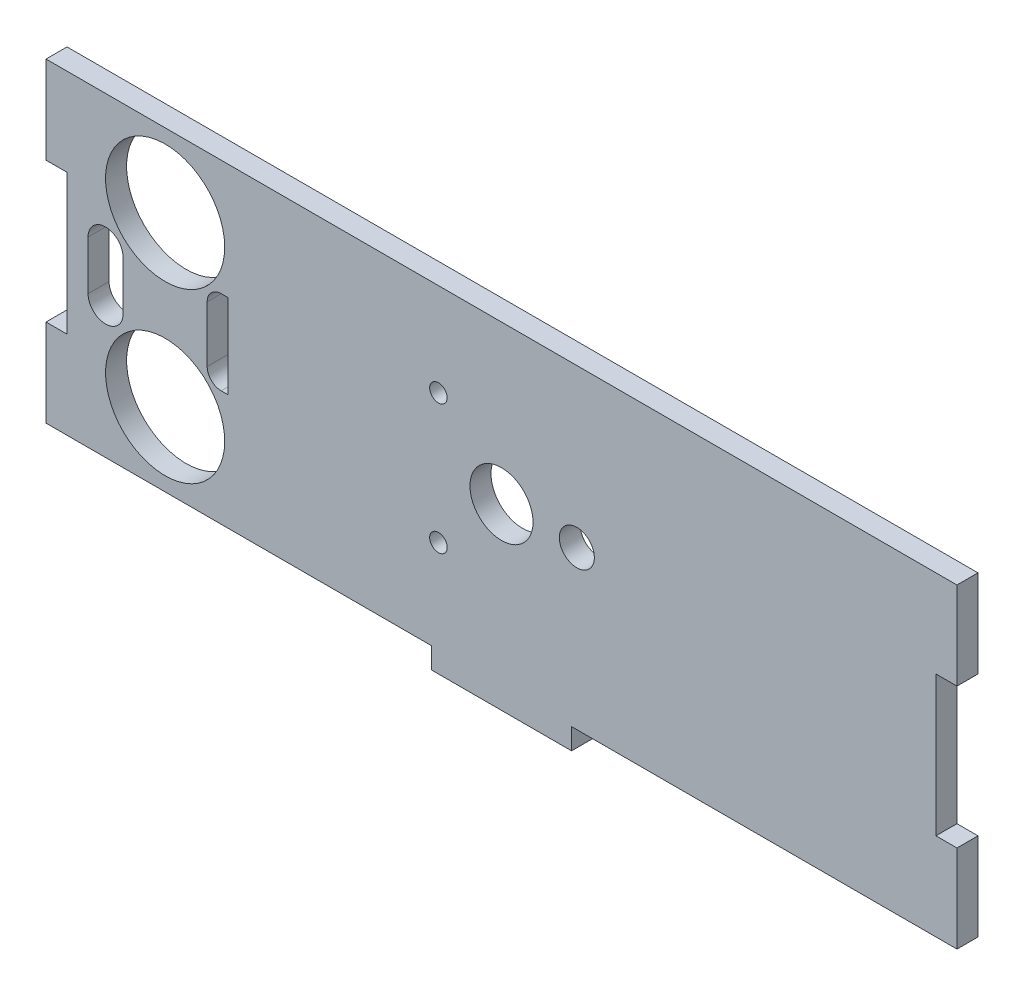
ISO-10303-21;
HEADER;
FILE_DESCRIPTION(('STEP AP214'),'2;1');
FILE_NAME('part.step','',(''),(''),'','','');
FILE_SCHEMA(('AUTOMOTIVE_DESIGN { 1 0 10303 214 1 1 1 1 }'));
ENDSEC;
DATA;
#1=APPLICATION_CONTEXT('core data for automotive mechanical design processes');
#2=APPLICATION_PROTOCOL_DEFINITION('international standard','automotive_design',2000,#1);
#3=PRODUCT_CONTEXT('',#1,'mechanical');
#4=PRODUCT('Part','Part','',(#3));
#5=PRODUCT_RELATED_PRODUCT_CATEGORY('part','',(#4));
#6=PRODUCT_DEFINITION_FORMATION('','',#4);
#7=PRODUCT_DEFINITION_CONTEXT('part definition',#1,'design');
#8=PRODUCT_DEFINITION('design','',#6,#7);
#9=PRODUCT_DEFINITION_SHAPE('','',#8);
#10=(LENGTH_UNIT() NAMED_UNIT(*) SI_UNIT(.MILLI.,.METRE.));
#11=(NAMED_UNIT(*) PLANE_ANGLE_UNIT() SI_UNIT($,.RADIAN.));
#12=(NAMED_UNIT(*) SI_UNIT($,.STERADIAN.) SOLID_ANGLE_UNIT());
#13=UNCERTAINTY_MEASURE_WITH_UNIT(LENGTH_MEASURE(1.E-05),#10,'distance_accuracy_value','');
#14=(GEOMETRIC_REPRESENTATION_CONTEXT(3) GLOBAL_UNCERTAINTY_ASSIGNED_CONTEXT((#13)) GLOBAL_UNIT_ASSIGNED_CONTEXT((#10,
#11,#12)) REPRESENTATION_CONTEXT('',''));
#15=CARTESIAN_POINT('',(0.,0.,0.));
#16=DIRECTION('',(0.,0.,1.));
#17=DIRECTION('',(1.,0.,0.));
#18=AXIS2_PLACEMENT_3D('',#15,#16,#17);
#19=CARTESIAN_POINT('',(0.,0.,3.));
#20=DIRECTION('',(0.,0.,1.));
#21=DIRECTION('',(1.,0.,0.));
#22=AXIS2_PLACEMENT_3D('',#19,#20,#21);
#23=PLANE('',#22);
#24=CARTESIAN_POINT('',(10.75,0.,3.));
#25=DIRECTION('',(0.,0.,1.));
#26=DIRECTION('',(1.,0.,0.));
#27=AXIS2_PLACEMENT_3D('',#24,#25,#26);
#28=CIRCLE('',#27,2.5);
#29=CARTESIAN_POINT('',(13.25,0.,3.));
#30=VERTEX_POINT('',#29);
#31=EDGE_CURVE('E901',#30,#30,#28,.T.);
#32=ORIENTED_EDGE('',*,*,#31,.F.);
#33=EDGE_LOOP('',(#32));
#34=FACE_BOUND('',#33,.T.);
#35=CARTESIAN_POINT('',(-9.,9.25,3.));
#36=DIRECTION('',(0.,0.,1.));
#37=DIRECTION('',(1.,0.,0.));
#38=AXIS2_PLACEMENT_3D('',#35,#36,#37);
#39=CIRCLE('',#38,1.25);
#40=CARTESIAN_POINT('',(-7.75,9.25,3.));
#41=VERTEX_POINT('',#40);
#42=EDGE_CURVE('E261',#41,#41,#39,.T.);
#43=ORIENTED_EDGE('',*,*,#42,.F.);
#44=EDGE_LOOP('',(#43));
#45=FACE_BOUND('',#44,.T.);
#46=CARTESIAN_POINT('',(-48.,12.,3.));
#47=DIRECTION('',(0.,0.,1.));
#48=DIRECTION('',(1.,0.,0.));
#49=AXIS2_PLACEMENT_3D('',#46,#47,#48);
#50=CIRCLE('',#49,8.50000000000001);
#51=CARTESIAN_POINT('',(-39.5,12.,3.));
#52=VERTEX_POINT('',#51);
#53=EDGE_CURVE('E342',#52,#52,#50,.T.);
#54=ORIENTED_EDGE('',*,*,#53,.F.);
#55=EDGE_LOOP('',(#54));
#56=FACE_BOUND('',#55,.T.);
#57=DIRECTION('',(0.,-1.,0.));
#58=VECTOR('',#57,1.);
#59=CARTESIAN_POINT('',(-65.,10.,3.));
#60=LINE('',#59,#58);
#61=CARTESIAN_POINT('',(-65.,22.5,3.));
#62=VERTEX_POINT('',#61);
#63=CARTESIAN_POINT('',(-65.,10.,3.));
#64=VERTEX_POINT('',#63);
#65=EDGE_CURVE('E350',#62,#64,#60,.T.);
#66=ORIENTED_EDGE('',*,*,#65,.T.);
#67=DIRECTION('',(1.,0.,0.));
#68=VECTOR('',#67,1.);
#69=CARTESIAN_POINT('',(-62.,10.,3.));
#70=LINE('',#69,#68);
#71=CARTESIAN_POINT('',(-62.,10.,3.));
#72=VERTEX_POINT('',#71);
#73=EDGE_CURVE('E354',#64,#72,#70,.T.);
#74=ORIENTED_EDGE('',*,*,#73,.T.);
#75=DIRECTION('',(0.,-1.,0.));
#76=VECTOR('',#75,1.);
#77=CARTESIAN_POINT('',(-62.,-10.,3.));
#78=LINE('',#77,#76);
#79=CARTESIAN_POINT('',(-62.,-10.,3.));
#80=VERTEX_POINT('',#79);
#81=EDGE_CURVE('E358',#72,#80,#78,.T.);
#82=ORIENTED_EDGE('',*,*,#81,.T.);
#83=DIRECTION('',(-1.,0.,0.));
#84=VECTOR('',#83,1.);
#85=CARTESIAN_POINT('',(-62.,-10.,3.));
#86=LINE('',#85,#84);
#87=CARTESIAN_POINT('',(-65.,-10.,3.));
#88=VERTEX_POINT('',#87);
#89=EDGE_CURVE('E361',#80,#88,#86,.T.);
#90=ORIENTED_EDGE('',*,*,#89,.T.);
#91=DIRECTION('',(0.,-1.,0.));
#92=VECTOR('',#91,1.);
#93=CARTESIAN_POINT('',(-65.,-22.5,3.));
#94=LINE('',#93,#92);
#95=CARTESIAN_POINT('',(-65.,-22.5,3.));
#96=VERTEX_POINT('',#95);
#97=EDGE_CURVE('E364',#88,#96,#94,.T.);
#98=ORIENTED_EDGE('',*,*,#97,.T.);
#99=DIRECTION('',(1.,0.,0.));
#100=VECTOR('',#99,1.);
#101=CARTESIAN_POINT('',(-10.,-22.5,3.));
#102=LINE('',#101,#100);
#103=CARTESIAN_POINT('',(-10.,-22.5,3.));
#104=VERTEX_POINT('',#103);
#105=EDGE_CURVE('E367',#96,#104,#102,.T.);
#106=ORIENTED_EDGE('',*,*,#105,.T.);
#107=DIRECTION('',(0.,-1.,0.));
#108=VECTOR('',#107,1.);
#109=CARTESIAN_POINT('',(-10.,-22.5,3.));
#110=LINE('',#109,#108);
#111=CARTESIAN_POINT('',(-10.,-25.5,3.));
#112=VERTEX_POINT('',#111);
#113=EDGE_CURVE('E370',#104,#112,#110,.T.);
#114=ORIENTED_EDGE('',*,*,#113,.T.);
#115=DIRECTION('',(1.,0.,0.));
#116=VECTOR('',#115,1.);
#117=CARTESIAN_POINT('',(-10.,-25.5,3.));
#118=LINE('',#117,#116);
#119=CARTESIAN_POINT('',(10.,-25.5,3.));
#120=VERTEX_POINT('',#119);
#121=EDGE_CURVE('E373',#112,#120,#118,.T.);
#122=ORIENTED_EDGE('',*,*,#121,.T.);
#123=DIRECTION('',(0.,1.,0.));
#124=VECTOR('',#123,1.);
#125=CARTESIAN_POINT('',(10.,-22.5,3.));
#126=LINE('',#125,#124);
#127=CARTESIAN_POINT('',(10.,-22.5,3.));
#128=VERTEX_POINT('',#127);
#129=EDGE_CURVE('E376',#120,#128,#126,.T.);
#130=ORIENTED_EDGE('',*,*,#129,.T.);
#131=DIRECTION('',(1.,0.,0.));
#132=VECTOR('',#131,1.);
#133=CARTESIAN_POINT('',(65.,-22.5,3.));
#134=LINE('',#133,#132);
#135=CARTESIAN_POINT('',(65.,-22.5,3.));
#136=VERTEX_POINT('',#135);
#137=EDGE_CURVE('E379',#128,#136,#134,.T.);
#138=ORIENTED_EDGE('',*,*,#137,.T.);
#139=DIRECTION('',(0.,1.,0.));
#140=VECTOR('',#139,1.);
#141=CARTESIAN_POINT('',(65.,-22.5,3.));
#142=LINE('',#141,#140);
#143=CARTESIAN_POINT('',(65.,-10.,3.));
#144=VERTEX_POINT('',#143);
#145=EDGE_CURVE('E382',#136,#144,#142,.T.);
#146=ORIENTED_EDGE('',*,*,#145,.T.);
#147=DIRECTION('',(-1.,0.,0.));
#148=VECTOR('',#147,1.);
#149=CARTESIAN_POINT('',(62.,-10.,3.));
#150=LINE('',#149,#148);
#151=CARTESIAN_POINT('',(62.,-10.,3.));
#152=VERTEX_POINT('',#151);
#153=EDGE_CURVE('E385',#144,#152,#150,.T.);
#154=ORIENTED_EDGE('',*,*,#153,.T.);
#155=DIRECTION('',(0.,1.,0.));
#156=VECTOR('',#155,1.);
#157=CARTESIAN_POINT('',(62.,-10.,3.));
#158=LINE('',#157,#156);
#159=CARTESIAN_POINT('',(62.,10.,3.));
#160=VERTEX_POINT('',#159);
#161=EDGE_CURVE('E388',#152,#160,#158,.T.);
#162=ORIENTED_EDGE('',*,*,#161,.T.);
#163=DIRECTION('',(1.,0.,0.));
#164=VECTOR('',#163,1.);
#165=CARTESIAN_POINT('',(62.,10.,3.));
#166=LINE('',#165,#164);
#167=CARTESIAN_POINT('',(65.,10.,3.));
#168=VERTEX_POINT('',#167);
#169=EDGE_CURVE('E391',#160,#168,#166,.T.);
#170=ORIENTED_EDGE('',*,*,#169,.T.);
#171=DIRECTION('',(0.,1.,0.));
#172=VECTOR('',#171,1.);
#173=CARTESIAN_POINT('',(65.,10.,3.));
#174=LINE('',#173,#172);
#175=CARTESIAN_POINT('',(65.,22.5,3.));
#176=VERTEX_POINT('',#175);
#177=EDGE_CURVE('E394',#168,#176,#174,.T.);
#178=ORIENTED_EDGE('',*,*,#177,.T.);
#179=DIRECTION('',(-1.,0.,0.));
#180=VECTOR('',#179,1.);
#181=CARTESIAN_POINT('',(65.,22.5,3.));
#182=LINE('',#181,#180);
#183=EDGE_CURVE('E397',#176,#62,#182,.T.);
#184=ORIENTED_EDGE('',*,*,#183,.T.);
#185=EDGE_LOOP('',(#66,#74,#82,#90,#98,#106,#114,#122,#130,#138,#146,#154,#162,#170,#178,#184));
#186=FACE_BOUND('',#185,.T.);
#187=CARTESIAN_POINT('',(-48.,-12.,3.));
#188=DIRECTION('',(0.,0.,1.));
#189=DIRECTION('',(1.,0.,0.));
#190=AXIS2_PLACEMENT_3D('',#187,#188,#189);
#191=CIRCLE('',#190,8.50000000000001);
#192=CARTESIAN_POINT('',(-39.5,-12.,3.));
#193=VERTEX_POINT('',#192);
#194=EDGE_CURVE('E334',#193,#193,#191,.T.);
#195=ORIENTED_EDGE('',*,*,#194,.F.);
#196=EDGE_LOOP('',(#195));
#197=FACE_BOUND('',#196,.T.);
#198=DIRECTION('',(0.,-1.,0.));
#199=VECTOR('',#198,1.);
#200=CARTESIAN_POINT('',(-59.,3.5,3.));
#201=LINE('',#200,#199);
#202=CARTESIAN_POINT('',(-59.,3.5,3.));
#203=VERTEX_POINT('',#202);
#204=CARTESIAN_POINT('',(-59.,-3.5,3.));
#205=VERTEX_POINT('',#204);
#206=EDGE_CURVE('E294',#203,#205,#201,.T.);
#207=ORIENTED_EDGE('',*,*,#206,.F.);
#208=CARTESIAN_POINT('',(-56.5,3.5,3.));
#209=DIRECTION('',(0.,0.,1.));
#210=DIRECTION('',(1.,0.,0.));
#211=AXIS2_PLACEMENT_3D('',#208,#209,#210);
#212=CIRCLE('',#211,2.5);
#213=CARTESIAN_POINT('',(-54.,3.5,3.));
#214=VERTEX_POINT('',#213);
#215=EDGE_CURVE('E291',#214,#203,#212,.T.);
#216=ORIENTED_EDGE('',*,*,#215,.F.);
#217=DIRECTION('',(0.,1.,0.));
#218=VECTOR('',#217,1.);
#219=CARTESIAN_POINT('',(-54.,3.5,3.));
#220=LINE('',#219,#218);
#221=CARTESIAN_POINT('',(-54.,-3.5,3.));
#222=VERTEX_POINT('',#221);
#223=EDGE_CURVE('E302',#222,#214,#220,.T.);
#224=ORIENTED_EDGE('',*,*,#223,.F.);
#225=CARTESIAN_POINT('',(-56.5,-3.5,3.));
#226=DIRECTION('',(0.,0.,1.));
#227=DIRECTION('',(1.,0.,0.));
#228=AXIS2_PLACEMENT_3D('',#225,#226,#227);
#229=CIRCLE('',#228,2.5);
#230=EDGE_CURVE('E298',#205,#222,#229,.T.);
#231=ORIENTED_EDGE('',*,*,#230,.F.);
#232=EDGE_LOOP('',(#207,#216,#224,#231));
#233=FACE_BOUND('',#232,.T.);
#234=DIRECTION('',(1.,0.,0.));
#235=VECTOR('',#234,1.);
#236=CARTESIAN_POINT('',(-39.,-6.,3.));
#237=LINE('',#236,#235);
#238=CARTESIAN_POINT('',(-40.,-6.,3.));
#239=VERTEX_POINT('',#238);
#240=CARTESIAN_POINT('',(-39.,-6.,3.));
#241=VERTEX_POINT('',#240);
#242=EDGE_CURVE('E228',#239,#241,#237,.T.);
#243=ORIENTED_EDGE('',*,*,#242,.F.);
#244=CARTESIAN_POINT('',(-40.,-4.,3.));
#245=DIRECTION('',(0.,0.,1.));
#246=DIRECTION('',(-1.,0.,0.));
#247=AXIS2_PLACEMENT_3D('',#244,#245,#246);
#248=CIRCLE('',#247,2.);
#249=CARTESIAN_POINT('',(-42.,-4.,3.));
#250=VERTEX_POINT('',#249);
#251=EDGE_CURVE('E219',#250,#239,#248,.T.);
#252=ORIENTED_EDGE('',*,*,#251,.F.);
#253=DIRECTION('',(0.,-1.,0.));
#254=VECTOR('',#253,1.);
#255=CARTESIAN_POINT('',(-42.,-4.,3.));
#256=LINE('',#255,#254);
#257=CARTESIAN_POINT('',(-42.,4.,3.));
#258=VERTEX_POINT('',#257);
#259=EDGE_CURVE('E256',#258,#250,#256,.T.);
#260=ORIENTED_EDGE('',*,*,#259,.F.);
#261=CARTESIAN_POINT('',(-40.,4.,3.));
#262=DIRECTION('',(0.,0.,1.));
#263=DIRECTION('',(1.,0.,0.));
#264=AXIS2_PLACEMENT_3D('',#261,#262,#263);
#265=CIRCLE('',#264,2.);
#266=CARTESIAN_POINT('',(-40.,6.,3.));
#267=VERTEX_POINT('',#266);
#268=EDGE_CURVE('E253',#267,#258,#265,.T.);
#269=ORIENTED_EDGE('',*,*,#268,.F.);
#270=DIRECTION('',(-1.,0.,0.));
#271=VECTOR('',#270,1.);
#272=CARTESIAN_POINT('',(-39.,6.,3.));
#273=LINE('',#272,#271);
#274=CARTESIAN_POINT('',(-39.,6.,3.));
#275=VERTEX_POINT('',#274);
#276=EDGE_CURVE('E247',#275,#267,#273,.T.);
#277=ORIENTED_EDGE('',*,*,#276,.F.);
#278=DIRECTION('',(0.,1.,0.));
#279=VECTOR('',#278,1.);
#280=CARTESIAN_POINT('',(-39.,-6.,3.));
#281=LINE('',#280,#279);
#282=EDGE_CURVE('E243',#241,#275,#281,.T.);
#283=ORIENTED_EDGE('',*,*,#282,.F.);
#284=EDGE_LOOP('',(#243,#252,#260,#269,#277,#283));
#285=FACE_BOUND('',#284,.T.);
#286=CARTESIAN_POINT('',(0.,0.,3.));
#287=DIRECTION('',(0.,0.,1.));
#288=DIRECTION('',(1.,0.,0.));
#289=AXIS2_PLACEMENT_3D('',#286,#287,#288);
#290=CIRCLE('',#289,4.5);
#291=CARTESIAN_POINT('',(4.5,0.,3.));
#292=VERTEX_POINT('',#291);
#293=EDGE_CURVE('E909',#292,#292,#290,.T.);
#294=ORIENTED_EDGE('',*,*,#293,.F.);
#295=EDGE_LOOP('',(#294));
#296=FACE_BOUND('',#295,.T.);
#297=CARTESIAN_POINT('',(-9.,-9.25,3.));
#298=DIRECTION('',(0.,0.,1.));
#299=DIRECTION('',(-1.,0.,0.));
#300=AXIS2_PLACEMENT_3D('',#297,#298,#299);
#301=CIRCLE('',#300,1.25);
#302=CARTESIAN_POINT('',(-10.25,-9.25,3.));
#303=VERTEX_POINT('',#302);
#304=EDGE_CURVE('E890',#303,#303,#301,.T.);
#305=ORIENTED_EDGE('',*,*,#304,.F.);
#306=EDGE_LOOP('',(#305));
#307=FACE_BOUND('',#306,.T.);
#308=ADVANCED_FACE('F45',(#34,#45,#56,#186,#197,#233,#285,#296,#307),#23,.T.);
#309=CARTESIAN_POINT('',(0.,0.,0.));
#310=DIRECTION('',(0.,0.,1.));
#311=DIRECTION('',(1.,0.,0.));
#312=AXIS2_PLACEMENT_3D('',#309,#310,#311);
#313=PLANE('',#312);
#314=CARTESIAN_POINT('',(-56.5,3.5,0.));
#315=DIRECTION('',(0.,0.,1.));
#316=DIRECTION('',(1.,0.,0.));
#317=AXIS2_PLACEMENT_3D('',#314,#315,#316);
#318=CIRCLE('',#317,2.5);
#319=CARTESIAN_POINT('',(-54.,3.5,0.));
#320=VERTEX_POINT('',#319);
#321=CARTESIAN_POINT('',(-59.,3.5,0.));
#322=VERTEX_POINT('',#321);
#323=EDGE_CURVE('E237',#320,#322,#318,.T.);
#324=ORIENTED_EDGE('',*,*,#323,.T.);
#325=DIRECTION('',(0.,-1.,0.));
#326=VECTOR('',#325,1.);
#327=CARTESIAN_POINT('',(-59.,3.5,0.));
#328=LINE('',#327,#326);
#329=CARTESIAN_POINT('',(-59.,-3.5,0.));
#330=VERTEX_POINT('',#329);
#331=EDGE_CURVE('E309',#322,#330,#328,.T.);
#332=ORIENTED_EDGE('',*,*,#331,.T.);
#333=CARTESIAN_POINT('',(-56.5,-3.5,0.));
#334=DIRECTION('',(0.,0.,1.));
#335=DIRECTION('',(1.,0.,0.));
#336=AXIS2_PLACEMENT_3D('',#333,#334,#335);
#337=CIRCLE('',#336,2.5);
#338=CARTESIAN_POINT('',(-54.,-3.5,0.));
#339=VERTEX_POINT('',#338);
#340=EDGE_CURVE('E313',#330,#339,#337,.T.);
#341=ORIENTED_EDGE('',*,*,#340,.T.);
#342=DIRECTION('',(0.,1.,0.));
#343=VECTOR('',#342,1.);
#344=CARTESIAN_POINT('',(-54.,3.5,0.));
#345=LINE('',#344,#343);
#346=EDGE_CURVE('E295',#339,#320,#345,.T.);
#347=ORIENTED_EDGE('',*,*,#346,.T.);
#348=EDGE_LOOP('',(#324,#332,#341,#347));
#349=FACE_BOUND('',#348,.T.);
#350=DIRECTION('',(0.,-1.,0.));
#351=VECTOR('',#350,1.);
#352=CARTESIAN_POINT('',(-65.,10.,0.));
#353=LINE('',#352,#351);
#354=CARTESIAN_POINT('',(-65.,22.5,0.));
#355=VERTEX_POINT('',#354);
#356=CARTESIAN_POINT('',(-65.,10.,0.));
#357=VERTEX_POINT('',#356);
#358=EDGE_CURVE('E346',#355,#357,#353,.T.);
#359=ORIENTED_EDGE('',*,*,#358,.F.);
#360=DIRECTION('',(-1.,0.,0.));
#361=VECTOR('',#360,1.);
#362=CARTESIAN_POINT('',(65.,22.5,0.));
#363=LINE('',#362,#361);
#364=CARTESIAN_POINT('',(65.,22.5,0.));
#365=VERTEX_POINT('',#364);
#366=EDGE_CURVE('E355',#365,#355,#363,.T.);
#367=ORIENTED_EDGE('',*,*,#366,.F.);
#368=DIRECTION('',(0.,1.,0.));
#369=VECTOR('',#368,1.);
#370=CARTESIAN_POINT('',(65.,10.,0.));
#371=LINE('',#370,#369);
#372=CARTESIAN_POINT('',(65.,10.,0.));
#373=VERTEX_POINT('',#372);
#374=EDGE_CURVE('E443',#373,#365,#371,.T.);
#375=ORIENTED_EDGE('',*,*,#374,.F.);
#376=DIRECTION('',(1.,0.,0.));
#377=VECTOR('',#376,1.);
#378=CARTESIAN_POINT('',(62.,10.,0.));
#379=LINE('',#378,#377);
#380=CARTESIAN_POINT('',(62.,10.,0.));
#381=VERTEX_POINT('',#380);
#382=EDGE_CURVE('E440',#381,#373,#379,.T.);
#383=ORIENTED_EDGE('',*,*,#382,.F.);
#384=DIRECTION('',(0.,1.,0.));
#385=VECTOR('',#384,1.);
#386=CARTESIAN_POINT('',(62.,-10.,0.));
#387=LINE('',#386,#385);
#388=CARTESIAN_POINT('',(62.,-10.,0.));
#389=VERTEX_POINT('',#388);
#390=EDGE_CURVE('E437',#389,#381,#387,.T.);
#391=ORIENTED_EDGE('',*,*,#390,.F.);
#392=DIRECTION('',(-1.,0.,0.));
#393=VECTOR('',#392,1.);
#394=CARTESIAN_POINT('',(62.,-10.,0.));
#395=LINE('',#394,#393);
#396=CARTESIAN_POINT('',(65.,-10.,0.));
#397=VERTEX_POINT('',#396);
#398=EDGE_CURVE('E434',#397,#389,#395,.T.);
#399=ORIENTED_EDGE('',*,*,#398,.F.);
#400=DIRECTION('',(0.,1.,0.));
#401=VECTOR('',#400,1.);
#402=CARTESIAN_POINT('',(65.,-22.5,0.));
#403=LINE('',#402,#401);
#404=CARTESIAN_POINT('',(65.,-22.5,0.));
#405=VERTEX_POINT('',#404);
#406=EDGE_CURVE('E431',#405,#397,#403,.T.);
#407=ORIENTED_EDGE('',*,*,#406,.F.);
#408=DIRECTION('',(1.,0.,0.));
#409=VECTOR('',#408,1.);
#410=CARTESIAN_POINT('',(65.,-22.5,0.));
#411=LINE('',#410,#409);
#412=CARTESIAN_POINT('',(10.,-22.5,0.));
#413=VERTEX_POINT('',#412);
#414=EDGE_CURVE('E428',#413,#405,#411,.T.);
#415=ORIENTED_EDGE('',*,*,#414,.F.);
#416=DIRECTION('',(0.,1.,0.));
#417=VECTOR('',#416,1.);
#418=CARTESIAN_POINT('',(10.,-22.5,0.));
#419=LINE('',#418,#417);
#420=CARTESIAN_POINT('',(10.,-25.5,0.));
#421=VERTEX_POINT('',#420);
#422=EDGE_CURVE('E425',#421,#413,#419,.T.);
#423=ORIENTED_EDGE('',*,*,#422,.F.);
#424=DIRECTION('',(1.,0.,0.));
#425=VECTOR('',#424,1.);
#426=CARTESIAN_POINT('',(-10.,-25.5,0.));
#427=LINE('',#426,#425);
#428=CARTESIAN_POINT('',(-10.,-25.5,0.));
#429=VERTEX_POINT('',#428);
#430=EDGE_CURVE('E422',#429,#421,#427,.T.);
#431=ORIENTED_EDGE('',*,*,#430,.F.);
#432=DIRECTION('',(0.,-1.,0.));
#433=VECTOR('',#432,1.);
#434=CARTESIAN_POINT('',(-10.,-22.5,0.));
#435=LINE('',#434,#433);
#436=CARTESIAN_POINT('',(-10.,-22.5,0.));
#437=VERTEX_POINT('',#436);
#438=EDGE_CURVE('E419',#437,#429,#435,.T.);
#439=ORIENTED_EDGE('',*,*,#438,.F.);
#440=DIRECTION('',(1.,0.,0.));
#441=VECTOR('',#440,1.);
#442=CARTESIAN_POINT('',(-10.,-22.5,0.));
#443=LINE('',#442,#441);
#444=CARTESIAN_POINT('',(-65.,-22.5,0.));
#445=VERTEX_POINT('',#444);
#446=EDGE_CURVE('E416',#445,#437,#443,.T.);
#447=ORIENTED_EDGE('',*,*,#446,.F.);
#448=DIRECTION('',(0.,-1.,0.));
#449=VECTOR('',#448,1.);
#450=CARTESIAN_POINT('',(-65.,-22.5,0.));
#451=LINE('',#450,#449);
#452=CARTESIAN_POINT('',(-65.,-10.,0.));
#453=VERTEX_POINT('',#452);
#454=EDGE_CURVE('E413',#453,#445,#451,.T.);
#455=ORIENTED_EDGE('',*,*,#454,.F.);
#456=DIRECTION('',(-1.,0.,0.));
#457=VECTOR('',#456,1.);
#458=CARTESIAN_POINT('',(-62.,-10.,0.));
#459=LINE('',#458,#457);
#460=CARTESIAN_POINT('',(-62.,-10.,0.));
#461=VERTEX_POINT('',#460);
#462=EDGE_CURVE('E410',#461,#453,#459,.T.);
#463=ORIENTED_EDGE('',*,*,#462,.F.);
#464=DIRECTION('',(0.,-1.,0.));
#465=VECTOR('',#464,1.);
#466=CARTESIAN_POINT('',(-62.,-10.,0.));
#467=LINE('',#466,#465);
#468=CARTESIAN_POINT('',(-62.,10.,0.));
#469=VERTEX_POINT('',#468);
#470=EDGE_CURVE('E407',#469,#461,#467,.T.);
#471=ORIENTED_EDGE('',*,*,#470,.F.);
#472=DIRECTION('',(1.,0.,0.));
#473=VECTOR('',#472,1.);
#474=CARTESIAN_POINT('',(-62.,10.,0.));
#475=LINE('',#474,#473);
#476=EDGE_CURVE('E404',#357,#469,#475,.T.);
#477=ORIENTED_EDGE('',*,*,#476,.F.);
#478=EDGE_LOOP('',(#359,#367,#375,#383,#391,#399,#407,#415,#423,#431,#439,#447,#455,#463,#471,#477));
#479=FACE_BOUND('',#478,.T.);
#480=CARTESIAN_POINT('',(-48.,12.,0.));
#481=DIRECTION('',(0.,0.,1.));
#482=DIRECTION('',(1.,0.,0.));
#483=AXIS2_PLACEMENT_3D('',#480,#481,#482);
#484=CIRCLE('',#483,8.50000000000001);
#485=CARTESIAN_POINT('',(-39.5,12.,0.));
#486=VERTEX_POINT('',#485);
#487=EDGE_CURVE('E338',#486,#486,#484,.T.);
#488=ORIENTED_EDGE('',*,*,#487,.T.);
#489=EDGE_LOOP('',(#488));
#490=FACE_BOUND('',#489,.T.);
#491=CARTESIAN_POINT('',(-48.,-12.,0.));
#492=DIRECTION('',(0.,0.,1.));
#493=DIRECTION('',(1.,0.,0.));
#494=AXIS2_PLACEMENT_3D('',#491,#492,#493);
#495=CIRCLE('',#494,8.50000000000001);
#496=CARTESIAN_POINT('',(-39.5,-12.,0.));
#497=VERTEX_POINT('',#496);
#498=EDGE_CURVE('E333',#497,#497,#495,.T.);
#499=ORIENTED_EDGE('',*,*,#498,.T.);
#500=EDGE_LOOP('',(#499));
#501=FACE_BOUND('',#500,.T.);
#502=CARTESIAN_POINT('',(-40.,-4.,0.));
#503=DIRECTION('',(0.,0.,1.));
#504=DIRECTION('',(-1.,0.,0.));
#505=AXIS2_PLACEMENT_3D('',#502,#503,#504);
#506=CIRCLE('',#505,2.);
#507=CARTESIAN_POINT('',(-42.,-4.,0.));
#508=VERTEX_POINT('',#507);
#509=CARTESIAN_POINT('',(-40.,-6.,0.));
#510=VERTEX_POINT('',#509);
#511=EDGE_CURVE('E69',#508,#510,#506,.T.);
#512=ORIENTED_EDGE('',*,*,#511,.T.);
#513=DIRECTION('',(1.,0.,0.));
#514=VECTOR('',#513,1.);
#515=CARTESIAN_POINT('',(-39.,-6.,0.));
#516=LINE('',#515,#514);
#517=CARTESIAN_POINT('',(-39.,-6.,0.));
#518=VERTEX_POINT('',#517);
#519=EDGE_CURVE('E235',#510,#518,#516,.T.);
#520=ORIENTED_EDGE('',*,*,#519,.T.);
#521=DIRECTION('',(0.,1.,0.));
#522=VECTOR('',#521,1.);
#523=CARTESIAN_POINT('',(-39.,-6.,0.));
#524=LINE('',#523,#522);
#525=CARTESIAN_POINT('',(-39.,6.,0.));
#526=VERTEX_POINT('',#525);
#527=EDGE_CURVE('E264',#518,#526,#524,.T.);
#528=ORIENTED_EDGE('',*,*,#527,.T.);
#529=DIRECTION('',(-1.,0.,0.));
#530=VECTOR('',#529,1.);
#531=CARTESIAN_POINT('',(-39.,6.,0.));
#532=LINE('',#531,#530);
#533=CARTESIAN_POINT('',(-40.,6.,0.));
#534=VERTEX_POINT('',#533);
#535=EDGE_CURVE('E268',#526,#534,#532,.T.);
#536=ORIENTED_EDGE('',*,*,#535,.T.);
#537=CARTESIAN_POINT('',(-40.,4.,0.));
#538=DIRECTION('',(0.,0.,1.));
#539=DIRECTION('',(1.,0.,0.));
#540=AXIS2_PLACEMENT_3D('',#537,#538,#539);
#541=CIRCLE('',#540,2.);
#542=CARTESIAN_POINT('',(-42.,4.,0.));
#543=VERTEX_POINT('',#542);
#544=EDGE_CURVE('E272',#534,#543,#541,.T.);
#545=ORIENTED_EDGE('',*,*,#544,.T.);
#546=DIRECTION('',(0.,-1.,0.));
#547=VECTOR('',#546,1.);
#548=CARTESIAN_POINT('',(-42.,-4.,0.));
#549=LINE('',#548,#547);
#550=EDGE_CURVE('E229',#543,#508,#549,.T.);
#551=ORIENTED_EDGE('',*,*,#550,.T.);
#552=EDGE_LOOP('',(#512,#520,#528,#536,#545,#551));
#553=FACE_BOUND('',#552,.T.);
#554=CARTESIAN_POINT('',(-9.,9.25,0.));
#555=DIRECTION('',(0.,0.,1.));
#556=DIRECTION('',(1.,0.,0.));
#557=AXIS2_PLACEMENT_3D('',#554,#555,#556);
#558=CIRCLE('',#557,1.25);
#559=CARTESIAN_POINT('',(-7.75,9.25,0.));
#560=VERTEX_POINT('',#559);
#561=EDGE_CURVE('E913',#560,#560,#558,.T.);
#562=ORIENTED_EDGE('',*,*,#561,.T.);
#563=EDGE_LOOP('',(#562));
#564=FACE_BOUND('',#563,.T.);
#565=CARTESIAN_POINT('',(0.,0.,0.));
#566=DIRECTION('',(0.,0.,1.));
#567=DIRECTION('',(1.,0.,0.));
#568=AXIS2_PLACEMENT_3D('',#565,#566,#567);
#569=CIRCLE('',#568,4.5);
#570=CARTESIAN_POINT('',(4.5,0.,0.));
#571=VERTEX_POINT('',#570);
#572=EDGE_CURVE('E905',#571,#571,#569,.T.);
#573=ORIENTED_EDGE('',*,*,#572,.T.);
#574=EDGE_LOOP('',(#573));
#575=FACE_BOUND('',#574,.T.);
#576=CARTESIAN_POINT('',(10.75,0.,0.));
#577=DIRECTION('',(0.,0.,1.));
#578=DIRECTION('',(1.,0.,0.));
#579=AXIS2_PLACEMENT_3D('',#576,#577,#578);
#580=CIRCLE('',#579,2.5);
#581=CARTESIAN_POINT('',(13.25,0.,0.));
#582=VERTEX_POINT('',#581);
#583=EDGE_CURVE('E898',#582,#582,#580,.T.);
#584=ORIENTED_EDGE('',*,*,#583,.T.);
#585=EDGE_LOOP('',(#584));
#586=FACE_BOUND('',#585,.T.);
#587=CARTESIAN_POINT('',(-9.,-9.25,0.));
#588=DIRECTION('',(0.,0.,1.));
#589=DIRECTION('',(-1.,0.,0.));
#590=AXIS2_PLACEMENT_3D('',#587,#588,#589);
#591=CIRCLE('',#590,1.25);
#592=CARTESIAN_POINT('',(-10.25,-9.25,0.));
#593=VERTEX_POINT('',#592);
#594=EDGE_CURVE('E893',#593,#593,#591,.T.);
#595=ORIENTED_EDGE('',*,*,#594,.T.);
#596=EDGE_LOOP('',(#595));
#597=FACE_BOUND('',#596,.T.);
#598=ADVANCED_FACE('F514',(#349,#479,#490,#501,#553,#564,#575,#586,#597),#313,.F.);
#599=CARTESIAN_POINT('',(-65.,10.,3.));
#600=DIRECTION('',(1.,0.,0.));
#601=DIRECTION('',(0.,1.,0.));
#602=AXIS2_PLACEMENT_3D('',#599,#600,#601);
#603=PLANE('',#602);
#604=ORIENTED_EDGE('',*,*,#358,.T.);
#605=DIRECTION('',(0.,0.,-1.));
#606=VECTOR('',#605,1.);
#607=CARTESIAN_POINT('',(-65.,10.,3.));
#608=LINE('',#607,#606);
#609=EDGE_CURVE('E11',#64,#357,#608,.T.);
#610=ORIENTED_EDGE('',*,*,#609,.F.);
#611=ORIENTED_EDGE('',*,*,#65,.F.);
#612=DIRECTION('',(0.,0.,-1.));
#613=VECTOR('',#612,1.);
#614=CARTESIAN_POINT('',(-65.,22.5,3.));
#615=LINE('',#614,#613);
#616=EDGE_CURVE('E400',#62,#355,#615,.T.);
#617=ORIENTED_EDGE('',*,*,#616,.T.);
#618=EDGE_LOOP('',(#604,#610,#611,#617));
#619=FACE_BOUND('',#618,.T.);
#620=ADVANCED_FACE('F47',(#619),#603,.F.);
#621=CARTESIAN_POINT('',(-62.,10.,3.));
#622=DIRECTION('',(0.,1.,0.));
#623=DIRECTION('',(-1.,0.,0.));
#624=AXIS2_PLACEMENT_3D('',#621,#622,#623);
#625=PLANE('',#624);
#626=ORIENTED_EDGE('',*,*,#476,.T.);
#627=DIRECTION('',(0.,0.,-1.));
#628=VECTOR('',#627,1.);
#629=CARTESIAN_POINT('',(-62.,10.,3.));
#630=LINE('',#629,#628);
#631=EDGE_CURVE('E54',#72,#469,#630,.T.);
#632=ORIENTED_EDGE('',*,*,#631,.F.);
#633=ORIENTED_EDGE('',*,*,#73,.F.);
#634=ORIENTED_EDGE('',*,*,#609,.T.);
#635=EDGE_LOOP('',(#626,#632,#633,#634));
#636=FACE_BOUND('',#635,.T.);
#637=ADVANCED_FACE('F532',(#636),#625,.F.);
#638=CARTESIAN_POINT('',(-62.,-10.,3.));
#639=DIRECTION('',(1.,0.,0.));
#640=DIRECTION('',(0.,0.,-1.));
#641=AXIS2_PLACEMENT_3D('',#638,#639,#640);
#642=PLANE('',#641);
#643=ORIENTED_EDGE('',*,*,#470,.T.);
#644=DIRECTION('',(0.,0.,-1.));
#645=VECTOR('',#644,1.);
#646=CARTESIAN_POINT('',(-62.,-10.,3.));
#647=LINE('',#646,#645);
#648=EDGE_CURVE('E499',#80,#461,#647,.T.);
#649=ORIENTED_EDGE('',*,*,#648,.F.);
#650=ORIENTED_EDGE('',*,*,#81,.F.);
#651=ORIENTED_EDGE('',*,*,#631,.T.);
#652=EDGE_LOOP('',(#643,#649,#650,#651));
#653=FACE_BOUND('',#652,.T.);
#654=ADVANCED_FACE('F508',(#653),#642,.F.);
#655=CARTESIAN_POINT('',(-62.,-10.,3.));
#656=DIRECTION('',(0.,-1.,0.));
#657=DIRECTION('',(0.,0.,-1.));
#658=AXIS2_PLACEMENT_3D('',#655,#656,#657);
#659=PLANE('',#658);
#660=ORIENTED_EDGE('',*,*,#462,.T.);
#661=DIRECTION('',(0.,0.,-1.));
#662=VECTOR('',#661,1.);
#663=CARTESIAN_POINT('',(-65.,-10.,3.));
#664=LINE('',#663,#662);
#665=EDGE_CURVE('E495',#88,#453,#664,.T.);
#666=ORIENTED_EDGE('',*,*,#665,.F.);
#667=ORIENTED_EDGE('',*,*,#89,.F.);
#668=ORIENTED_EDGE('',*,*,#648,.T.);
#669=EDGE_LOOP('',(#660,#666,#667,#668));
#670=FACE_BOUND('',#669,.T.);
#671=ADVANCED_FACE('F520',(#670),#659,.F.);
#672=CARTESIAN_POINT('',(-65.,-22.5,3.));
#673=DIRECTION('',(1.,0.,0.));
#674=DIRECTION('',(0.,1.,0.));
#675=AXIS2_PLACEMENT_3D('',#672,#673,#674);
#676=PLANE('',#675);
#677=ORIENTED_EDGE('',*,*,#454,.T.);
#678=DIRECTION('',(0.,0.,-1.));
#679=VECTOR('',#678,1.);
#680=CARTESIAN_POINT('',(-65.,-22.5,3.));
#681=LINE('',#680,#679);
#682=EDGE_CURVE('E491',#96,#445,#681,.T.);
#683=ORIENTED_EDGE('',*,*,#682,.F.);
#684=ORIENTED_EDGE('',*,*,#97,.F.);
#685=ORIENTED_EDGE('',*,*,#665,.T.);
#686=EDGE_LOOP('',(#677,#683,#684,#685));
#687=FACE_BOUND('',#686,.T.);
#688=ADVANCED_FACE('F524',(#687),#676,.F.);
#689=CARTESIAN_POINT('',(-10.,-22.5,3.));
#690=DIRECTION('',(0.,1.,0.));
#691=DIRECTION('',(-1.,0.,0.));
#692=AXIS2_PLACEMENT_3D('',#689,#690,#691);
#693=PLANE('',#692);
#694=ORIENTED_EDGE('',*,*,#446,.T.);
#695=DIRECTION('',(0.,0.,-1.));
#696=VECTOR('',#695,1.);
#697=CARTESIAN_POINT('',(-10.,-22.5,3.));
#698=LINE('',#697,#696);
#699=EDGE_CURVE('E487',#104,#437,#698,.T.);
#700=ORIENTED_EDGE('',*,*,#699,.F.);
#701=ORIENTED_EDGE('',*,*,#105,.F.);
#702=ORIENTED_EDGE('',*,*,#682,.T.);
#703=EDGE_LOOP('',(#694,#700,#701,#702));
#704=FACE_BOUND('',#703,.T.);
#705=ADVANCED_FACE('F585',(#704),#693,.F.);
#706=CARTESIAN_POINT('',(-10.,-22.5,3.));
#707=DIRECTION('',(1.,0.,0.));
#708=DIRECTION('',(0.,0.,-1.));
#709=AXIS2_PLACEMENT_3D('',#706,#707,#708);
#710=PLANE('',#709);
#711=ORIENTED_EDGE('',*,*,#438,.T.);
#712=DIRECTION('',(0.,0.,-1.));
#713=VECTOR('',#712,1.);
#714=CARTESIAN_POINT('',(-10.,-25.5,3.));
#715=LINE('',#714,#713);
#716=EDGE_CURVE('E483',#112,#429,#715,.T.);
#717=ORIENTED_EDGE('',*,*,#716,.F.);
#718=ORIENTED_EDGE('',*,*,#113,.F.);
#719=ORIENTED_EDGE('',*,*,#699,.T.);
#720=EDGE_LOOP('',(#711,#717,#718,#719));
#721=FACE_BOUND('',#720,.T.);
#722=ADVANCED_FACE('F582',(#721),#710,.F.);
#723=CARTESIAN_POINT('',(-10.,-25.5,3.));
#724=DIRECTION('',(0.,1.,0.));
#725=DIRECTION('',(0.,0.,1.));
#726=AXIS2_PLACEMENT_3D('',#723,#724,#725);
#727=PLANE('',#726);
#728=ORIENTED_EDGE('',*,*,#430,.T.);
#729=DIRECTION('',(0.,0.,-1.));
#730=VECTOR('',#729,1.);
#731=CARTESIAN_POINT('',(10.,-25.5,3.));
#732=LINE('',#731,#730);
#733=EDGE_CURVE('E479',#120,#421,#732,.T.);
#734=ORIENTED_EDGE('',*,*,#733,.F.);
#735=ORIENTED_EDGE('',*,*,#121,.F.);
#736=ORIENTED_EDGE('',*,*,#716,.T.);
#737=EDGE_LOOP('',(#728,#734,#735,#736));
#738=FACE_BOUND('',#737,.T.);
#739=ADVANCED_FACE('F578',(#738),#727,.F.);
#740=CARTESIAN_POINT('',(10.,-22.5,3.));
#741=DIRECTION('',(-1.,0.,0.));
#742=DIRECTION('',(0.,0.,1.));
#743=AXIS2_PLACEMENT_3D('',#740,#741,#742);
#744=PLANE('',#743);
#745=ORIENTED_EDGE('',*,*,#422,.T.);
#746=DIRECTION('',(0.,0.,-1.));
#747=VECTOR('',#746,1.);
#748=CARTESIAN_POINT('',(10.,-22.5,3.));
#749=LINE('',#748,#747);
#750=EDGE_CURVE('E475',#128,#413,#749,.T.);
#751=ORIENTED_EDGE('',*,*,#750,.F.);
#752=ORIENTED_EDGE('',*,*,#129,.F.);
#753=ORIENTED_EDGE('',*,*,#733,.T.);
#754=EDGE_LOOP('',(#745,#751,#752,#753));
#755=FACE_BOUND('',#754,.T.);
#756=ADVANCED_FACE('F574',(#755),#744,.F.);
#757=CARTESIAN_POINT('',(65.,-22.5,3.));
#758=DIRECTION('',(0.,1.,0.));
#759=DIRECTION('',(-1.,0.,0.));
#760=AXIS2_PLACEMENT_3D('',#757,#758,#759);
#761=PLANE('',#760);
#762=ORIENTED_EDGE('',*,*,#414,.T.);
#763=DIRECTION('',(0.,0.,-1.));
#764=VECTOR('',#763,1.);
#765=CARTESIAN_POINT('',(65.,-22.5,3.));
#766=LINE('',#765,#764);
#767=EDGE_CURVE('E471',#136,#405,#766,.T.);
#768=ORIENTED_EDGE('',*,*,#767,.F.);
#769=ORIENTED_EDGE('',*,*,#137,.F.);
#770=ORIENTED_EDGE('',*,*,#750,.T.);
#771=EDGE_LOOP('',(#762,#768,#769,#770));
#772=FACE_BOUND('',#771,.T.);
#773=ADVANCED_FACE('F569',(#772),#761,.F.);
#774=CARTESIAN_POINT('',(65.,-22.5,3.));
#775=DIRECTION('',(-1.,0.,0.));
#776=DIRECTION('',(0.,-1.,0.));
#777=AXIS2_PLACEMENT_3D('',#774,#775,#776);
#778=PLANE('',#777);
#779=ORIENTED_EDGE('',*,*,#406,.T.);
#780=DIRECTION('',(0.,0.,-1.));
#781=VECTOR('',#780,1.);
#782=CARTESIAN_POINT('',(65.,-10.,3.));
#783=LINE('',#782,#781);
#784=EDGE_CURVE('E467',#144,#397,#783,.T.);
#785=ORIENTED_EDGE('',*,*,#784,.F.);
#786=ORIENTED_EDGE('',*,*,#145,.F.);
#787=ORIENTED_EDGE('',*,*,#767,.T.);
#788=EDGE_LOOP('',(#779,#785,#786,#787));
#789=FACE_BOUND('',#788,.T.);
#790=ADVANCED_FACE('F563',(#789),#778,.F.);
#791=CARTESIAN_POINT('',(62.,-10.,3.));
#792=DIRECTION('',(0.,-1.,0.));
#793=DIRECTION('',(0.,0.,-1.));
#794=AXIS2_PLACEMENT_3D('',#791,#792,#793);
#795=PLANE('',#794);
#796=ORIENTED_EDGE('',*,*,#398,.T.);
#797=DIRECTION('',(0.,0.,-1.));
#798=VECTOR('',#797,1.);
#799=CARTESIAN_POINT('',(62.,-10.,3.));
#800=LINE('',#799,#798);
#801=EDGE_CURVE('E463',#152,#389,#800,.T.);
#802=ORIENTED_EDGE('',*,*,#801,.F.);
#803=ORIENTED_EDGE('',*,*,#153,.F.);
#804=ORIENTED_EDGE('',*,*,#784,.T.);
#805=EDGE_LOOP('',(#796,#802,#803,#804));
#806=FACE_BOUND('',#805,.T.);
#807=ADVANCED_FACE('F559',(#806),#795,.F.);
#808=CARTESIAN_POINT('',(62.,-10.,3.));
#809=DIRECTION('',(-1.,0.,0.));
#810=DIRECTION('',(0.,0.,1.));
#811=AXIS2_PLACEMENT_3D('',#808,#809,#810);
#812=PLANE('',#811);
#813=ORIENTED_EDGE('',*,*,#390,.T.);
#814=DIRECTION('',(0.,0.,-1.));
#815=VECTOR('',#814,1.);
#816=CARTESIAN_POINT('',(62.,10.,3.));
#817=LINE('',#816,#815);
#818=EDGE_CURVE('E459',#160,#381,#817,.T.);
#819=ORIENTED_EDGE('',*,*,#818,.F.);
#820=ORIENTED_EDGE('',*,*,#161,.F.);
#821=ORIENTED_EDGE('',*,*,#801,.T.);
#822=EDGE_LOOP('',(#813,#819,#820,#821));
#823=FACE_BOUND('',#822,.T.);
#824=ADVANCED_FACE('F554',(#823),#812,.F.);
#825=CARTESIAN_POINT('',(62.,10.,3.));
#826=DIRECTION('',(0.,1.,0.));
#827=DIRECTION('',(-1.,0.,0.));
#828=AXIS2_PLACEMENT_3D('',#825,#826,#827);
#829=PLANE('',#828);
#830=ORIENTED_EDGE('',*,*,#382,.T.);
#831=DIRECTION('',(0.,0.,-1.));
#832=VECTOR('',#831,1.);
#833=CARTESIAN_POINT('',(65.,10.,3.));
#834=LINE('',#833,#832);
#835=EDGE_CURVE('E455',#168,#373,#834,.T.);
#836=ORIENTED_EDGE('',*,*,#835,.F.);
#837=ORIENTED_EDGE('',*,*,#169,.F.);
#838=ORIENTED_EDGE('',*,*,#818,.T.);
#839=EDGE_LOOP('',(#830,#836,#837,#838));
#840=FACE_BOUND('',#839,.T.);
#841=ADVANCED_FACE('F548',(#840),#829,.F.);
#842=CARTESIAN_POINT('',(65.,10.,3.));
#843=DIRECTION('',(-1.,0.,0.));
#844=DIRECTION('',(0.,-1.,0.));
#845=AXIS2_PLACEMENT_3D('',#842,#843,#844);
#846=PLANE('',#845);
#847=ORIENTED_EDGE('',*,*,#374,.T.);
#848=DIRECTION('',(0.,0.,-1.));
#849=VECTOR('',#848,1.);
#850=CARTESIAN_POINT('',(65.,22.5,3.));
#851=LINE('',#850,#849);
#852=EDGE_CURVE('E451',#176,#365,#851,.T.);
#853=ORIENTED_EDGE('',*,*,#852,.F.);
#854=ORIENTED_EDGE('',*,*,#177,.F.);
#855=ORIENTED_EDGE('',*,*,#835,.T.);
#856=EDGE_LOOP('',(#847,#853,#854,#855));
#857=FACE_BOUND('',#856,.T.);
#858=ADVANCED_FACE('F544',(#857),#846,.F.);
#859=CARTESIAN_POINT('',(65.,22.5,3.));
#860=DIRECTION('',(0.,-1.,0.));
#861=DIRECTION('',(1.,0.,0.));
#862=AXIS2_PLACEMENT_3D('',#859,#860,#861);
#863=PLANE('',#862);
#864=ORIENTED_EDGE('',*,*,#366,.T.);
#865=ORIENTED_EDGE('',*,*,#616,.F.);
#866=ORIENTED_EDGE('',*,*,#183,.F.);
#867=ORIENTED_EDGE('',*,*,#852,.T.);
#868=EDGE_LOOP('',(#864,#865,#866,#867));
#869=FACE_BOUND('',#868,.T.);
#870=ADVANCED_FACE('F539',(#869),#863,.F.);
#871=CARTESIAN_POINT('',(-48.,12.,3.));
#872=DIRECTION('',(0.,0.,-1.));
#873=DIRECTION('',(-1.,0.,0.));
#874=AXIS2_PLACEMENT_3D('',#871,#872,#873);
#875=CYLINDRICAL_SURFACE('',#874,8.50000000000001);
#876=ORIENTED_EDGE('',*,*,#53,.T.);
#877=EDGE_LOOP('',(#876));
#878=FACE_BOUND('',#877,.T.);
#879=ORIENTED_EDGE('',*,*,#487,.F.);
#880=EDGE_LOOP('',(#879));
#881=FACE_BOUND('',#880,.T.);
#882=ADVANCED_FACE('F605',(#878,#881),#875,.F.);
#883=CARTESIAN_POINT('',(-48.,-12.,3.));
#884=DIRECTION('',(0.,0.,-1.));
#885=DIRECTION('',(-1.,0.,0.));
#886=AXIS2_PLACEMENT_3D('',#883,#884,#885);
#887=CYLINDRICAL_SURFACE('',#886,8.50000000000001);
#888=ORIENTED_EDGE('',*,*,#194,.T.);
#889=EDGE_LOOP('',(#888));
#890=FACE_BOUND('',#889,.T.);
#891=ORIENTED_EDGE('',*,*,#498,.F.);
#892=EDGE_LOOP('',(#891));
#893=FACE_BOUND('',#892,.T.);
#894=ADVANCED_FACE('F676',(#890,#893),#887,.F.);
#895=CARTESIAN_POINT('',(-56.5,3.5,3.));
#896=DIRECTION('',(0.,0.,-1.));
#897=DIRECTION('',(-1.,0.,0.));
#898=AXIS2_PLACEMENT_3D('',#895,#896,#897);
#899=CYLINDRICAL_SURFACE('',#898,2.5);
#900=ORIENTED_EDGE('',*,*,#323,.F.);
#901=DIRECTION('',(0.,0.,-1.));
#902=VECTOR('',#901,1.);
#903=CARTESIAN_POINT('',(-54.,3.5,3.));
#904=LINE('',#903,#902);
#905=EDGE_CURVE('E305',#214,#320,#904,.T.);
#906=ORIENTED_EDGE('',*,*,#905,.F.);
#907=ORIENTED_EDGE('',*,*,#215,.T.);
#908=DIRECTION('',(0.,0.,-1.));
#909=VECTOR('',#908,1.);
#910=CARTESIAN_POINT('',(-59.,3.5,3.));
#911=LINE('',#910,#909);
#912=EDGE_CURVE('E329',#203,#322,#911,.T.);
#913=ORIENTED_EDGE('',*,*,#912,.T.);
#914=EDGE_LOOP('',(#900,#906,#907,#913));
#915=FACE_BOUND('',#914,.T.);
#916=ADVANCED_FACE('F684',(#915),#899,.F.);
#917=CARTESIAN_POINT('',(-59.,3.5,3.));
#918=DIRECTION('',(1.,0.,0.));
#919=DIRECTION('',(0.,0.,-1.));
#920=AXIS2_PLACEMENT_3D('',#917,#918,#919);
#921=PLANE('',#920);
#922=ORIENTED_EDGE('',*,*,#331,.F.);
#923=ORIENTED_EDGE('',*,*,#912,.F.);
#924=ORIENTED_EDGE('',*,*,#206,.T.);
#925=DIRECTION('',(0.,0.,-1.));
#926=VECTOR('',#925,1.);
#927=CARTESIAN_POINT('',(-59.,-3.5,3.));
#928=LINE('',#927,#926);
#929=EDGE_CURVE('E326',#205,#330,#928,.T.);
#930=ORIENTED_EDGE('',*,*,#929,.T.);
#931=EDGE_LOOP('',(#922,#923,#924,#930));
#932=FACE_BOUND('',#931,.T.);
#933=ADVANCED_FACE('F692',(#932),#921,.T.);
#934=CARTESIAN_POINT('',(-56.5,-3.5,3.));
#935=DIRECTION('',(0.,0.,-1.));
#936=DIRECTION('',(-1.,0.,0.));
#937=AXIS2_PLACEMENT_3D('',#934,#935,#936);
#938=CYLINDRICAL_SURFACE('',#937,2.5);
#939=ORIENTED_EDGE('',*,*,#340,.F.);
#940=ORIENTED_EDGE('',*,*,#929,.F.);
#941=ORIENTED_EDGE('',*,*,#230,.T.);
#942=DIRECTION('',(0.,0.,-1.));
#943=VECTOR('',#942,1.);
#944=CARTESIAN_POINT('',(-54.,-3.5,3.));
#945=LINE('',#944,#943);
#946=EDGE_CURVE('E323',#222,#339,#945,.T.);
#947=ORIENTED_EDGE('',*,*,#946,.T.);
#948=EDGE_LOOP('',(#939,#940,#941,#947));
#949=FACE_BOUND('',#948,.T.);
#950=ADVANCED_FACE('F701',(#949),#938,.F.);
#951=CARTESIAN_POINT('',(-54.,3.5,3.));
#952=DIRECTION('',(-1.,0.,0.));
#953=DIRECTION('',(0.,0.,1.));
#954=AXIS2_PLACEMENT_3D('',#951,#952,#953);
#955=PLANE('',#954);
#956=ORIENTED_EDGE('',*,*,#346,.F.);
#957=ORIENTED_EDGE('',*,*,#946,.F.);
#958=ORIENTED_EDGE('',*,*,#223,.T.);
#959=ORIENTED_EDGE('',*,*,#905,.T.);
#960=EDGE_LOOP('',(#956,#957,#958,#959));
#961=FACE_BOUND('',#960,.T.);
#962=ADVANCED_FACE('F710',(#961),#955,.T.);
#963=CARTESIAN_POINT('',(-40.,-4.,3.));
#964=DIRECTION('',(0.,0.,-1.));
#965=DIRECTION('',(-1.,0.,0.));
#966=AXIS2_PLACEMENT_3D('',#963,#964,#965);
#967=CYLINDRICAL_SURFACE('',#966,2.);
#968=ORIENTED_EDGE('',*,*,#511,.F.);
#969=DIRECTION('',(0.,0.,-1.));
#970=VECTOR('',#969,1.);
#971=CARTESIAN_POINT('',(-42.,-4.,3.));
#972=LINE('',#971,#970);
#973=EDGE_CURVE('E223',#250,#508,#972,.T.);
#974=ORIENTED_EDGE('',*,*,#973,.F.);
#975=ORIENTED_EDGE('',*,*,#251,.T.);
#976=DIRECTION('',(0.,0.,-1.));
#977=VECTOR('',#976,1.);
#978=CARTESIAN_POINT('',(-40.,-6.,3.));
#979=LINE('',#978,#977);
#980=EDGE_CURVE('E222',#239,#510,#979,.T.);
#981=ORIENTED_EDGE('',*,*,#980,.T.);
#982=EDGE_LOOP('',(#968,#974,#975,#981));
#983=FACE_BOUND('',#982,.T.);
#984=ADVANCED_FACE('F221',(#983),#967,.F.);
#985=CARTESIAN_POINT('',(-39.,-6.,3.));
#986=DIRECTION('',(0.,1.,0.));
#987=DIRECTION('',(-1.,0.,0.));
#988=AXIS2_PLACEMENT_3D('',#985,#986,#987);
#989=PLANE('',#988);
#990=ORIENTED_EDGE('',*,*,#519,.F.);
#991=ORIENTED_EDGE('',*,*,#980,.F.);
#992=ORIENTED_EDGE('',*,*,#242,.T.);
#993=DIRECTION('',(0.,0.,-1.));
#994=VECTOR('',#993,1.);
#995=CARTESIAN_POINT('',(-39.,-6.,3.));
#996=LINE('',#995,#994);
#997=EDGE_CURVE('E238',#241,#518,#996,.T.);
#998=ORIENTED_EDGE('',*,*,#997,.T.);
#999=EDGE_LOOP('',(#990,#991,#992,#998));
#1000=FACE_BOUND('',#999,.T.);
#1001=ADVANCED_FACE('F232',(#1000),#989,.T.);
#1002=CARTESIAN_POINT('',(-39.,-6.,3.));
#1003=DIRECTION('',(-1.,0.,0.));
#1004=DIRECTION('',(0.,0.,1.));
#1005=AXIS2_PLACEMENT_3D('',#1002,#1003,#1004);
#1006=PLANE('',#1005);
#1007=ORIENTED_EDGE('',*,*,#527,.F.);
#1008=ORIENTED_EDGE('',*,*,#997,.F.);
#1009=ORIENTED_EDGE('',*,*,#282,.T.);
#1010=DIRECTION('',(0.,0.,-1.));
#1011=VECTOR('',#1010,1.);
#1012=CARTESIAN_POINT('',(-39.,6.,3.));
#1013=LINE('',#1012,#1011);
#1014=EDGE_CURVE('E286',#275,#526,#1013,.T.);
#1015=ORIENTED_EDGE('',*,*,#1014,.T.);
#1016=EDGE_LOOP('',(#1007,#1008,#1009,#1015));
#1017=FACE_BOUND('',#1016,.T.);
#1018=ADVANCED_FACE('F734',(#1017),#1006,.T.);
#1019=CARTESIAN_POINT('',(-39.,6.,3.));
#1020=DIRECTION('',(0.,-1.,0.));
#1021=DIRECTION('',(1.,0.,0.));
#1022=AXIS2_PLACEMENT_3D('',#1019,#1020,#1021);
#1023=PLANE('',#1022);
#1024=ORIENTED_EDGE('',*,*,#535,.F.);
#1025=ORIENTED_EDGE('',*,*,#1014,.F.);
#1026=ORIENTED_EDGE('',*,*,#276,.T.);
#1027=DIRECTION('',(0.,0.,-1.));
#1028=VECTOR('',#1027,1.);
#1029=CARTESIAN_POINT('',(-40.,6.,3.));
#1030=LINE('',#1029,#1028);
#1031=EDGE_CURVE('E283',#267,#534,#1030,.T.);
#1032=ORIENTED_EDGE('',*,*,#1031,.T.);
#1033=EDGE_LOOP('',(#1024,#1025,#1026,#1032));
#1034=FACE_BOUND('',#1033,.T.);
#1035=ADVANCED_FACE('F742',(#1034),#1023,.T.);
#1036=CARTESIAN_POINT('',(-40.,4.,3.));
#1037=DIRECTION('',(0.,0.,-1.));
#1038=DIRECTION('',(-1.,0.,0.));
#1039=AXIS2_PLACEMENT_3D('',#1036,#1037,#1038);
#1040=CYLINDRICAL_SURFACE('',#1039,2.);
#1041=ORIENTED_EDGE('',*,*,#544,.F.);
#1042=ORIENTED_EDGE('',*,*,#1031,.F.);
#1043=ORIENTED_EDGE('',*,*,#268,.T.);
#1044=DIRECTION('',(0.,0.,-1.));
#1045=VECTOR('',#1044,1.);
#1046=CARTESIAN_POINT('',(-42.,4.,3.));
#1047=LINE('',#1046,#1045);
#1048=EDGE_CURVE('E61',#258,#543,#1047,.T.);
#1049=ORIENTED_EDGE('',*,*,#1048,.T.);
#1050=EDGE_LOOP('',(#1041,#1042,#1043,#1049));
#1051=FACE_BOUND('',#1050,.T.);
#1052=ADVANCED_FACE('F751',(#1051),#1040,.F.);
#1053=CARTESIAN_POINT('',(-42.,-4.,3.));
#1054=DIRECTION('',(1.,0.,0.));
#1055=DIRECTION('',(0.,0.,-1.));
#1056=AXIS2_PLACEMENT_3D('',#1053,#1054,#1055);
#1057=PLANE('',#1056);
#1058=ORIENTED_EDGE('',*,*,#550,.F.);
#1059=ORIENTED_EDGE('',*,*,#1048,.F.);
#1060=ORIENTED_EDGE('',*,*,#259,.T.);
#1061=ORIENTED_EDGE('',*,*,#973,.T.);
#1062=EDGE_LOOP('',(#1058,#1059,#1060,#1061));
#1063=FACE_BOUND('',#1062,.T.);
#1064=ADVANCED_FACE('F760',(#1063),#1057,.T.);
#1065=CARTESIAN_POINT('',(-9.,9.25,3.));
#1066=DIRECTION('',(0.,0.,-1.));
#1067=DIRECTION('',(-1.,0.,0.));
#1068=AXIS2_PLACEMENT_3D('',#1065,#1066,#1067);
#1069=CYLINDRICAL_SURFACE('',#1068,1.25);
#1070=ORIENTED_EDGE('',*,*,#42,.T.);
#1071=EDGE_LOOP('',(#1070));
#1072=FACE_BOUND('',#1071,.T.);
#1073=ORIENTED_EDGE('',*,*,#561,.F.);
#1074=EDGE_LOOP('',(#1073));
#1075=FACE_BOUND('',#1074,.T.);
#1076=ADVANCED_FACE('F769',(#1072,#1075),#1069,.F.);
#1077=CARTESIAN_POINT('',(0.,0.,3.));
#1078=DIRECTION('',(0.,0.,-1.));
#1079=DIRECTION('',(-1.,0.,0.));
#1080=AXIS2_PLACEMENT_3D('',#1077,#1078,#1079);
#1081=CYLINDRICAL_SURFACE('',#1080,4.5);
#1082=ORIENTED_EDGE('',*,*,#293,.T.);
#1083=EDGE_LOOP('',(#1082));
#1084=FACE_BOUND('',#1083,.T.);
#1085=ORIENTED_EDGE('',*,*,#572,.F.);
#1086=EDGE_LOOP('',(#1085));
#1087=FACE_BOUND('',#1086,.T.);
#1088=ADVANCED_FACE('F777',(#1084,#1087),#1081,.F.);
#1089=CARTESIAN_POINT('',(10.75,0.,3.));
#1090=DIRECTION('',(0.,0.,-1.));
#1091=DIRECTION('',(-1.,0.,0.));
#1092=AXIS2_PLACEMENT_3D('',#1089,#1090,#1091);
#1093=CYLINDRICAL_SURFACE('',#1092,2.5);
#1094=ORIENTED_EDGE('',*,*,#31,.T.);
#1095=EDGE_LOOP('',(#1094));
#1096=FACE_BOUND('',#1095,.T.);
#1097=ORIENTED_EDGE('',*,*,#583,.F.);
#1098=EDGE_LOOP('',(#1097));
#1099=FACE_BOUND('',#1098,.T.);
#1100=ADVANCED_FACE('F786',(#1096,#1099),#1093,.F.);
#1101=CARTESIAN_POINT('',(-9.,-9.25,3.));
#1102=DIRECTION('',(0.,0.,-1.));
#1103=DIRECTION('',(-1.,0.,0.));
#1104=AXIS2_PLACEMENT_3D('',#1101,#1102,#1103);
#1105=CYLINDRICAL_SURFACE('',#1104,1.25);
#1106=ORIENTED_EDGE('',*,*,#304,.T.);
#1107=EDGE_LOOP('',(#1106));
#1108=FACE_BOUND('',#1107,.T.);
#1109=ORIENTED_EDGE('',*,*,#594,.F.);
#1110=EDGE_LOOP('',(#1109));
#1111=FACE_BOUND('',#1110,.T.);
#1112=ADVANCED_FACE('F795',(#1108,#1111),#1105,.F.);
#1113=CLOSED_SHELL('',(#308,#598,#620,#637,#654,#671,#688,#705,#722,#739,#756,#773,#790,#807,
#824,#841,#858,#870,#882,#894,#916,#933,#950,#962,#984,#1001,#1018,#1035,#1052,#1064,#1076,
#1088,#1100,#1112));
#1114=MANIFOLD_SOLID_BREP('B2',#1113);
#1115=ADVANCED_BREP_SHAPE_REPRESENTATION('',(#18,#1114),#14);
#1116=SHAPE_DEFINITION_REPRESENTATION(#9,#1115);
ENDSEC;
END-ISO-10303-21;
